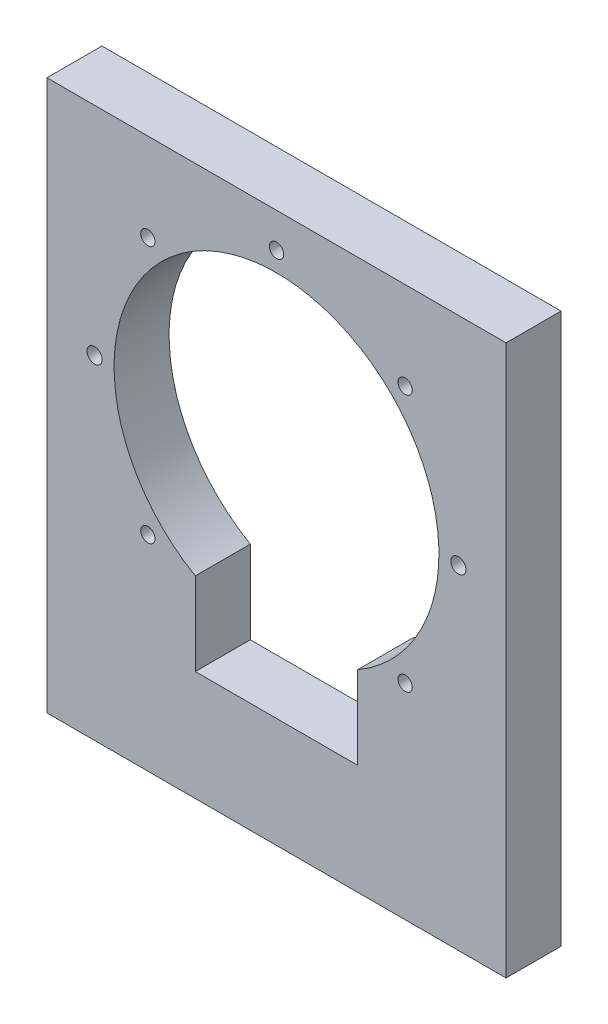
ISO-10303-21;
HEADER;
FILE_DESCRIPTION(('STEP AP214'),'2;1');
FILE_NAME('part.step','',(''),(''),'','','');
FILE_SCHEMA(('AUTOMOTIVE_DESIGN { 1 0 10303 214 1 1 1 1 }'));
ENDSEC;
DATA;
#1=APPLICATION_CONTEXT('core data for automotive mechanical design processes');
#2=APPLICATION_PROTOCOL_DEFINITION('international standard','automotive_design',2000,#1);
#3=PRODUCT_CONTEXT('',#1,'mechanical');
#4=PRODUCT('Part','Part','',(#3));
#5=PRODUCT_RELATED_PRODUCT_CATEGORY('part','',(#4));
#6=PRODUCT_DEFINITION_FORMATION('','',#4);
#7=PRODUCT_DEFINITION_CONTEXT('part definition',#1,'design');
#8=PRODUCT_DEFINITION('design','',#6,#7);
#9=PRODUCT_DEFINITION_SHAPE('','',#8);
#10=(LENGTH_UNIT() NAMED_UNIT(*) SI_UNIT(.MILLI.,.METRE.));
#11=(NAMED_UNIT(*) PLANE_ANGLE_UNIT() SI_UNIT($,.RADIAN.));
#12=(NAMED_UNIT(*) SI_UNIT($,.STERADIAN.) SOLID_ANGLE_UNIT());
#13=UNCERTAINTY_MEASURE_WITH_UNIT(LENGTH_MEASURE(1.E-05),#10,'distance_accuracy_value','');
#14=(GEOMETRIC_REPRESENTATION_CONTEXT(3) GLOBAL_UNCERTAINTY_ASSIGNED_CONTEXT((#13)) GLOBAL_UNIT_ASSIGNED_CONTEXT((#10,
#11,#12)) REPRESENTATION_CONTEXT('',''));
#15=CARTESIAN_POINT('',(0.,0.,0.));
#16=DIRECTION('',(0.,0.,1.));
#17=DIRECTION('',(1.,0.,0.));
#18=AXIS2_PLACEMENT_3D('',#15,#16,#17);
#19=CARTESIAN_POINT('',(0.,0.,12.7));
#20=DIRECTION('',(0.,0.,1.));
#21=DIRECTION('',(1.,0.,0.));
#22=AXIS2_PLACEMENT_3D('',#19,#20,#21);
#23=PLANE('',#22);
#24=CARTESIAN_POINT('',(10.9999975500028,26.1999984,12.7));
#25=DIRECTION('',(0.,0.,1.));
#26=DIRECTION('',(1.,0.,0.));
#27=AXIS2_PLACEMENT_3D('',#24,#25,#26);
#28=CIRCLE('',#27,1.746);
#29=CARTESIAN_POINT('',(12.7459975500028,26.1999984,12.7));
#30=VERTEX_POINT('',#29);
#31=EDGE_CURVE('E303',#30,#30,#28,.T.);
#32=ORIENTED_EDGE('',*,*,#31,.F.);
#33=EDGE_LOOP('',(#32));
#34=FACE_BOUND('',#33,.T.);
#35=CARTESIAN_POINT('',(82.6984865422514,-3.49849059224461,12.7));
#36=DIRECTION('',(0.,0.,1.));
#37=DIRECTION('',(1.,0.,0.));
#38=AXIS2_PLACEMENT_3D('',#35,#36,#37);
#39=CIRCLE('',#38,1.64973);
#40=CARTESIAN_POINT('',(84.3482165422514,-3.49849059224461,12.7));
#41=VERTEX_POINT('',#40);
#42=EDGE_CURVE('E319',#41,#41,#39,.T.);
#43=ORIENTED_EDGE('',*,*,#42,.F.);
#44=EDGE_LOOP('',(#43));
#45=FACE_BOUND('',#44,.T.);
#46=CARTESIAN_POINT('',(82.6984865422474,55.8984824922486,12.7));
#47=DIRECTION('',(0.,0.,1.));
#48=DIRECTION('',(1.,0.,0.));
#49=AXIS2_PLACEMENT_3D('',#46,#47,#48);
#50=CIRCLE('',#49,1.64973);
#51=CARTESIAN_POINT('',(84.3482165422474,55.8984824922486,12.7));
#52=VERTEX_POINT('',#51);
#53=EDGE_CURVE('E335',#52,#52,#50,.T.);
#54=ORIENTED_EDGE('',*,*,#53,.F.);
#55=EDGE_LOOP('',(#54));
#56=FACE_BOUND('',#55,.T.);
#57=DIRECTION('',(0.,-1.,0.));
#58=VECTOR('',#57,1.);
#59=CARTESIAN_POINT('',(34.25,-6.27595424191641,12.7));
#60=LINE('',#59,#58);
#61=CARTESIAN_POINT('',(34.25,-6.27595424191641,12.7));
#62=VERTEX_POINT('',#61);
#63=CARTESIAN_POINT('',(34.25,-25.4,12.7));
#64=VERTEX_POINT('',#63);
#65=EDGE_CURVE('E122',#62,#64,#60,.T.);
#66=ORIENTED_EDGE('',*,*,#65,.F.);
#67=CARTESIAN_POINT('',(53.,26.1999984,12.7));
#68=DIRECTION('',(0.,0.,1.));
#69=DIRECTION('',(1.,0.,0.));
#70=AXIS2_PLACEMENT_3D('',#67,#68,#69);
#71=CIRCLE('',#70,37.5);
#72=CARTESIAN_POINT('',(71.7500000000001,-6.27595424191641,12.7));
#73=VERTEX_POINT('',#72);
#74=EDGE_CURVE('E113',#73,#62,#71,.T.);
#75=ORIENTED_EDGE('',*,*,#74,.F.);
#76=DIRECTION('',(0.,1.,0.));
#77=VECTOR('',#76,1.);
#78=CARTESIAN_POINT('',(71.7500000000001,-6.27595424191641,12.7));
#79=LINE('',#78,#77);
#80=CARTESIAN_POINT('',(71.7500000000001,-25.4,12.7));
#81=VERTEX_POINT('',#80);
#82=EDGE_CURVE('E142',#81,#73,#79,.T.);
#83=ORIENTED_EDGE('',*,*,#82,.F.);
#84=DIRECTION('',(1.,0.,0.));
#85=VECTOR('',#84,1.);
#86=CARTESIAN_POINT('',(71.7500000000001,-25.4,12.7));
#87=LINE('',#86,#85);
#88=EDGE_CURVE('E136',#64,#81,#87,.T.);
#89=ORIENTED_EDGE('',*,*,#88,.F.);
#90=EDGE_LOOP('',(#66,#75,#83,#89));
#91=FACE_BOUND('',#90,.T.);
#92=DIRECTION('',(0.,1.,0.));
#93=VECTOR('',#92,1.);
#94=CARTESIAN_POINT('',(106.,76.2,12.7));
#95=LINE('',#94,#93);
#96=CARTESIAN_POINT('',(106.,-50.8,12.7));
#97=VERTEX_POINT('',#96);
#98=CARTESIAN_POINT('',(106.,76.2,12.7));
#99=VERTEX_POINT('',#98);
#100=EDGE_CURVE('E166',#97,#99,#95,.T.);
#101=ORIENTED_EDGE('',*,*,#100,.T.);
#102=DIRECTION('',(-1.,0.,0.));
#103=VECTOR('',#102,1.);
#104=CARTESIAN_POINT('',(0.,76.2,12.7));
#105=LINE('',#104,#103);
#106=CARTESIAN_POINT('',(0.,76.2,12.7));
#107=VERTEX_POINT('',#106);
#108=EDGE_CURVE('E170',#99,#107,#105,.T.);
#109=ORIENTED_EDGE('',*,*,#108,.T.);
#110=DIRECTION('',(0.,-1.,0.));
#111=VECTOR('',#110,1.);
#112=CARTESIAN_POINT('',(0.,76.2,12.7));
#113=LINE('',#112,#111);
#114=CARTESIAN_POINT('',(0.,-50.8,12.7));
#115=VERTEX_POINT('',#114);
#116=EDGE_CURVE('E174',#107,#115,#113,.T.);
#117=ORIENTED_EDGE('',*,*,#116,.T.);
#118=DIRECTION('',(1.,0.,0.));
#119=VECTOR('',#118,1.);
#120=CARTESIAN_POINT('',(0.,-50.8,12.7));
#121=LINE('',#120,#119);
#122=EDGE_CURVE('E177',#115,#97,#121,.T.);
#123=ORIENTED_EDGE('',*,*,#122,.T.);
#124=EDGE_LOOP('',(#101,#109,#117,#123));
#125=FACE_BOUND('',#124,.T.);
#126=CARTESIAN_POINT('',(53.,68.1999984,12.7));
#127=DIRECTION('',(0.,0.,1.));
#128=DIRECTION('',(1.,0.,0.));
#129=AXIS2_PLACEMENT_3D('',#126,#127,#128);
#130=CIRCLE('',#129,1.64973);
#131=CARTESIAN_POINT('',(54.64973,68.1999984,12.7));
#132=VERTEX_POINT('',#131);
#133=EDGE_CURVE('E150',#132,#132,#130,.T.);
#134=ORIENTED_EDGE('',*,*,#133,.F.);
#135=EDGE_LOOP('',(#134));
#136=FACE_BOUND('',#135,.T.);
#137=CARTESIAN_POINT('',(95.0000024500028,26.1999959500028,12.7));
#138=DIRECTION('',(0.,0.,1.));
#139=DIRECTION('',(1.,0.,0.));
#140=AXIS2_PLACEMENT_3D('',#137,#138,#139);
#141=CIRCLE('',#140,1.746);
#142=CARTESIAN_POINT('',(96.7460024500028,26.1999959500028,12.7));
#143=VERTEX_POINT('',#142);
#144=EDGE_CURVE('E327',#143,#143,#141,.T.);
#145=ORIENTED_EDGE('',*,*,#144,.F.);
#146=EDGE_LOOP('',(#145));
#147=FACE_BOUND('',#146,.T.);
#148=CARTESIAN_POINT('',(23.3015134577582,-3.49849059224861,12.7));
#149=DIRECTION('',(0.,0.,1.));
#150=DIRECTION('',(1.,0.,0.));
#151=AXIS2_PLACEMENT_3D('',#148,#149,#150);
#152=CIRCLE('',#151,1.64973);
#153=CARTESIAN_POINT('',(24.9512434577582,-3.49849059224861,12.7));
#154=VERTEX_POINT('',#153);
#155=EDGE_CURVE('E311',#154,#154,#152,.T.);
#156=ORIENTED_EDGE('',*,*,#155,.F.);
#157=EDGE_LOOP('',(#156));
#158=FACE_BOUND('',#157,.T.);
#159=CARTESIAN_POINT('',(23.3015134577542,55.8984824922446,12.7));
#160=DIRECTION('',(0.,0.,1.));
#161=DIRECTION('',(1.,0.,0.));
#162=AXIS2_PLACEMENT_3D('',#159,#160,#161);
#163=CIRCLE('',#162,1.64973);
#164=CARTESIAN_POINT('',(24.9512434577542,55.8984824922446,12.7));
#165=VERTEX_POINT('',#164);
#166=EDGE_CURVE('E290',#165,#165,#163,.T.);
#167=ORIENTED_EDGE('',*,*,#166,.F.);
#168=EDGE_LOOP('',(#167));
#169=FACE_BOUND('',#168,.T.);
#170=ADVANCED_FACE('F47',(#34,#45,#56,#91,#125,#136,#147,#158,#169),#23,.T.);
#171=CARTESIAN_POINT('',(0.,0.,0.));
#172=DIRECTION('',(0.,0.,1.));
#173=DIRECTION('',(1.,0.,0.));
#174=AXIS2_PLACEMENT_3D('',#171,#172,#173);
#175=PLANE('',#174);
#176=DIRECTION('',(0.,1.,0.));
#177=VECTOR('',#176,1.);
#178=CARTESIAN_POINT('',(106.,76.2,0.));
#179=LINE('',#178,#177);
#180=CARTESIAN_POINT('',(106.,-50.8,0.));
#181=VERTEX_POINT('',#180);
#182=CARTESIAN_POINT('',(106.,76.2,0.));
#183=VERTEX_POINT('',#182);
#184=EDGE_CURVE('E131',#181,#183,#179,.T.);
#185=ORIENTED_EDGE('',*,*,#184,.F.);
#186=DIRECTION('',(1.,0.,0.));
#187=VECTOR('',#186,1.);
#188=CARTESIAN_POINT('',(0.,-50.8,0.));
#189=LINE('',#188,#187);
#190=CARTESIAN_POINT('',(0.,-50.8,0.));
#191=VERTEX_POINT('',#190);
#192=EDGE_CURVE('E171',#191,#181,#189,.T.);
#193=ORIENTED_EDGE('',*,*,#192,.F.);
#194=DIRECTION('',(0.,-1.,0.));
#195=VECTOR('',#194,1.);
#196=CARTESIAN_POINT('',(0.,76.2,0.));
#197=LINE('',#196,#195);
#198=CARTESIAN_POINT('',(0.,76.2,0.));
#199=VERTEX_POINT('',#198);
#200=EDGE_CURVE('E187',#199,#191,#197,.T.);
#201=ORIENTED_EDGE('',*,*,#200,.F.);
#202=DIRECTION('',(-1.,0.,0.));
#203=VECTOR('',#202,1.);
#204=CARTESIAN_POINT('',(0.,76.2,0.));
#205=LINE('',#204,#203);
#206=EDGE_CURVE('E184',#183,#199,#205,.T.);
#207=ORIENTED_EDGE('',*,*,#206,.F.);
#208=EDGE_LOOP('',(#185,#193,#201,#207));
#209=FACE_BOUND('',#208,.T.);
#210=CARTESIAN_POINT('',(53.,26.1999984,0.));
#211=DIRECTION('',(0.,0.,1.));
#212=DIRECTION('',(1.,0.,0.));
#213=AXIS2_PLACEMENT_3D('',#210,#211,#212);
#214=CIRCLE('',#213,37.5);
#215=CARTESIAN_POINT('',(71.7500000000001,-6.27595424191641,0.));
#216=VERTEX_POINT('',#215);
#217=CARTESIAN_POINT('',(34.25,-6.27595424191641,0.));
#218=VERTEX_POINT('',#217);
#219=EDGE_CURVE('E71',#216,#218,#214,.T.);
#220=ORIENTED_EDGE('',*,*,#219,.T.);
#221=DIRECTION('',(0.,-1.,0.));
#222=VECTOR('',#221,1.);
#223=CARTESIAN_POINT('',(34.25,-6.27595424191641,0.));
#224=LINE('',#223,#222);
#225=CARTESIAN_POINT('',(34.25,-25.4,0.));
#226=VERTEX_POINT('',#225);
#227=EDGE_CURVE('E129',#218,#226,#224,.T.);
#228=ORIENTED_EDGE('',*,*,#227,.T.);
#229=DIRECTION('',(1.,0.,0.));
#230=VECTOR('',#229,1.);
#231=CARTESIAN_POINT('',(71.7500000000001,-25.4,0.));
#232=LINE('',#231,#230);
#233=CARTESIAN_POINT('',(71.7500000000001,-25.4,0.));
#234=VERTEX_POINT('',#233);
#235=EDGE_CURVE('E153',#226,#234,#232,.T.);
#236=ORIENTED_EDGE('',*,*,#235,.T.);
#237=DIRECTION('',(0.,1.,0.));
#238=VECTOR('',#237,1.);
#239=CARTESIAN_POINT('',(71.7500000000001,-6.27595424191641,0.));
#240=LINE('',#239,#238);
#241=EDGE_CURVE('E123',#234,#216,#240,.T.);
#242=ORIENTED_EDGE('',*,*,#241,.T.);
#243=EDGE_LOOP('',(#220,#228,#236,#242));
#244=FACE_BOUND('',#243,.T.);
#245=CARTESIAN_POINT('',(53.,68.1999984,0.));
#246=DIRECTION('',(0.,0.,1.));
#247=DIRECTION('',(1.,0.,0.));
#248=AXIS2_PLACEMENT_3D('',#245,#246,#247);
#249=CIRCLE('',#248,1.64973);
#250=CARTESIAN_POINT('',(54.64973,68.1999984,0.));
#251=VERTEX_POINT('',#250);
#252=EDGE_CURVE('E339',#251,#251,#249,.T.);
#253=ORIENTED_EDGE('',*,*,#252,.T.);
#254=EDGE_LOOP('',(#253));
#255=FACE_BOUND('',#254,.T.);
#256=CARTESIAN_POINT('',(82.6984865422474,55.8984824922486,0.));
#257=DIRECTION('',(0.,0.,1.));
#258=DIRECTION('',(1.,0.,0.));
#259=AXIS2_PLACEMENT_3D('',#256,#257,#258);
#260=CIRCLE('',#259,1.64973);
#261=CARTESIAN_POINT('',(84.3482165422474,55.8984824922486,0.));
#262=VERTEX_POINT('',#261);
#263=EDGE_CURVE('E331',#262,#262,#260,.T.);
#264=ORIENTED_EDGE('',*,*,#263,.T.);
#265=EDGE_LOOP('',(#264));
#266=FACE_BOUND('',#265,.T.);
#267=CARTESIAN_POINT('',(95.0000024500028,26.1999959500028,0.));
#268=DIRECTION('',(0.,0.,1.));
#269=DIRECTION('',(1.,0.,0.));
#270=AXIS2_PLACEMENT_3D('',#267,#268,#269);
#271=CIRCLE('',#270,1.746);
#272=CARTESIAN_POINT('',(96.7460024500028,26.1999959500028,0.));
#273=VERTEX_POINT('',#272);
#274=EDGE_CURVE('E323',#273,#273,#271,.T.);
#275=ORIENTED_EDGE('',*,*,#274,.T.);
#276=EDGE_LOOP('',(#275));
#277=FACE_BOUND('',#276,.T.);
#278=CARTESIAN_POINT('',(82.6984865422514,-3.49849059224461,0.));
#279=DIRECTION('',(0.,0.,1.));
#280=DIRECTION('',(1.,0.,0.));
#281=AXIS2_PLACEMENT_3D('',#278,#279,#280);
#282=CIRCLE('',#281,1.64973);
#283=CARTESIAN_POINT('',(84.3482165422514,-3.49849059224461,0.));
#284=VERTEX_POINT('',#283);
#285=EDGE_CURVE('E315',#284,#284,#282,.T.);
#286=ORIENTED_EDGE('',*,*,#285,.T.);
#287=EDGE_LOOP('',(#286));
#288=FACE_BOUND('',#287,.T.);
#289=CARTESIAN_POINT('',(23.3015134577582,-3.49849059224861,0.));
#290=DIRECTION('',(0.,0.,1.));
#291=DIRECTION('',(1.,0.,0.));
#292=AXIS2_PLACEMENT_3D('',#289,#290,#291);
#293=CIRCLE('',#292,1.64973);
#294=CARTESIAN_POINT('',(24.9512434577582,-3.49849059224861,0.));
#295=VERTEX_POINT('',#294);
#296=EDGE_CURVE('E307',#295,#295,#293,.T.);
#297=ORIENTED_EDGE('',*,*,#296,.T.);
#298=EDGE_LOOP('',(#297));
#299=FACE_BOUND('',#298,.T.);
#300=CARTESIAN_POINT('',(10.9999975500028,26.1999984,0.));
#301=DIRECTION('',(0.,0.,1.));
#302=DIRECTION('',(1.,0.,0.));
#303=AXIS2_PLACEMENT_3D('',#300,#301,#302);
#304=CIRCLE('',#303,1.746);
#305=CARTESIAN_POINT('',(12.7459975500028,26.1999984,0.));
#306=VERTEX_POINT('',#305);
#307=EDGE_CURVE('E300',#306,#306,#304,.T.);
#308=ORIENTED_EDGE('',*,*,#307,.T.);
#309=EDGE_LOOP('',(#308));
#310=FACE_BOUND('',#309,.T.);
#311=CARTESIAN_POINT('',(23.3015134577542,55.8984824922446,0.));
#312=DIRECTION('',(0.,0.,1.));
#313=DIRECTION('',(1.,0.,0.));
#314=AXIS2_PLACEMENT_3D('',#311,#312,#313);
#315=CIRCLE('',#314,1.64973);
#316=CARTESIAN_POINT('',(24.9512434577542,55.8984824922446,0.));
#317=VERTEX_POINT('',#316);
#318=EDGE_CURVE('E293',#317,#317,#315,.T.);
#319=ORIENTED_EDGE('',*,*,#318,.T.);
#320=EDGE_LOOP('',(#319));
#321=FACE_BOUND('',#320,.T.);
#322=ADVANCED_FACE('F212',(#209,#244,#255,#266,#277,#288,#299,#310,#321),#175,.F.);
#323=CARTESIAN_POINT('',(106.,76.2,12.7));
#324=DIRECTION('',(-1.,0.,0.));
#325=DIRECTION('',(0.,-1.,0.));
#326=AXIS2_PLACEMENT_3D('',#323,#324,#325);
#327=PLANE('',#326);
#328=ORIENTED_EDGE('',*,*,#184,.T.);
#329=DIRECTION('',(0.,0.,-1.));
#330=VECTOR('',#329,1.);
#331=CARTESIAN_POINT('',(106.,76.2,12.7));
#332=LINE('',#331,#330);
#333=EDGE_CURVE('E11',#99,#183,#332,.T.);
#334=ORIENTED_EDGE('',*,*,#333,.F.);
#335=ORIENTED_EDGE('',*,*,#100,.F.);
#336=DIRECTION('',(0.,0.,-1.));
#337=VECTOR('',#336,1.);
#338=CARTESIAN_POINT('',(106.,-50.8,12.7));
#339=LINE('',#338,#337);
#340=EDGE_CURVE('E180',#97,#181,#339,.T.);
#341=ORIENTED_EDGE('',*,*,#340,.T.);
#342=EDGE_LOOP('',(#328,#334,#335,#341));
#343=FACE_BOUND('',#342,.T.);
#344=ADVANCED_FACE('F49',(#343),#327,.F.);
#345=CARTESIAN_POINT('',(0.,76.2,12.7));
#346=DIRECTION('',(0.,-1.,0.));
#347=DIRECTION('',(0.,0.,-1.));
#348=AXIS2_PLACEMENT_3D('',#345,#346,#347);
#349=PLANE('',#348);
#350=ORIENTED_EDGE('',*,*,#206,.T.);
#351=DIRECTION('',(0.,0.,-1.));
#352=VECTOR('',#351,1.);
#353=CARTESIAN_POINT('',(0.,76.2,12.7));
#354=LINE('',#353,#352);
#355=EDGE_CURVE('E56',#107,#199,#354,.T.);
#356=ORIENTED_EDGE('',*,*,#355,.F.);
#357=ORIENTED_EDGE('',*,*,#108,.F.);
#358=ORIENTED_EDGE('',*,*,#333,.T.);
#359=EDGE_LOOP('',(#350,#356,#357,#358));
#360=FACE_BOUND('',#359,.T.);
#361=ADVANCED_FACE('F222',(#360),#349,.F.);
#362=CARTESIAN_POINT('',(0.,76.2,12.7));
#363=DIRECTION('',(1.,0.,0.));
#364=DIRECTION('',(0.,1.,0.));
#365=AXIS2_PLACEMENT_3D('',#362,#363,#364);
#366=PLANE('',#365);
#367=ORIENTED_EDGE('',*,*,#200,.T.);
#368=DIRECTION('',(0.,0.,-1.));
#369=VECTOR('',#368,1.);
#370=CARTESIAN_POINT('',(0.,-50.8,12.7));
#371=LINE('',#370,#369);
#372=EDGE_CURVE('E195',#115,#191,#371,.T.);
#373=ORIENTED_EDGE('',*,*,#372,.F.);
#374=ORIENTED_EDGE('',*,*,#116,.F.);
#375=ORIENTED_EDGE('',*,*,#355,.T.);
#376=EDGE_LOOP('',(#367,#373,#374,#375));
#377=FACE_BOUND('',#376,.T.);
#378=ADVANCED_FACE('F206',(#377),#366,.F.);
#379=CARTESIAN_POINT('',(0.,-50.8,12.7));
#380=DIRECTION('',(0.,1.,0.));
#381=DIRECTION('',(0.,0.,1.));
#382=AXIS2_PLACEMENT_3D('',#379,#380,#381);
#383=PLANE('',#382);
#384=ORIENTED_EDGE('',*,*,#192,.T.);
#385=ORIENTED_EDGE('',*,*,#340,.F.);
#386=ORIENTED_EDGE('',*,*,#122,.F.);
#387=ORIENTED_EDGE('',*,*,#372,.T.);
#388=EDGE_LOOP('',(#384,#385,#386,#387));
#389=FACE_BOUND('',#388,.T.);
#390=ADVANCED_FACE('F216',(#389),#383,.F.);
#391=CARTESIAN_POINT('',(53.,26.1999984,12.7));
#392=DIRECTION('',(0.,0.,-1.));
#393=DIRECTION('',(-1.,0.,0.));
#394=AXIS2_PLACEMENT_3D('',#391,#392,#393);
#395=CYLINDRICAL_SURFACE('',#394,37.5);
#396=ORIENTED_EDGE('',*,*,#219,.F.);
#397=DIRECTION('',(0.,0.,-1.));
#398=VECTOR('',#397,1.);
#399=CARTESIAN_POINT('',(71.7500000000001,-6.27595424191641,12.7));
#400=LINE('',#399,#398);
#401=EDGE_CURVE('E117',#73,#216,#400,.T.);
#402=ORIENTED_EDGE('',*,*,#401,.F.);
#403=ORIENTED_EDGE('',*,*,#74,.T.);
#404=DIRECTION('',(0.,0.,-1.));
#405=VECTOR('',#404,1.);
#406=CARTESIAN_POINT('',(34.25,-6.27595424191641,12.7));
#407=LINE('',#406,#405);
#408=EDGE_CURVE('E116',#62,#218,#407,.T.);
#409=ORIENTED_EDGE('',*,*,#408,.T.);
#410=EDGE_LOOP('',(#396,#402,#403,#409));
#411=FACE_BOUND('',#410,.T.);
#412=ADVANCED_FACE('F115',(#411),#395,.F.);
#413=CARTESIAN_POINT('',(34.25,-6.27595424191641,12.7));
#414=DIRECTION('',(1.,0.,0.));
#415=DIRECTION('',(0.,1.,0.));
#416=AXIS2_PLACEMENT_3D('',#413,#414,#415);
#417=PLANE('',#416);
#418=ORIENTED_EDGE('',*,*,#227,.F.);
#419=ORIENTED_EDGE('',*,*,#408,.F.);
#420=ORIENTED_EDGE('',*,*,#65,.T.);
#421=DIRECTION('',(0.,0.,-1.));
#422=VECTOR('',#421,1.);
#423=CARTESIAN_POINT('',(34.25,-25.4,12.7));
#424=LINE('',#423,#422);
#425=EDGE_CURVE('E132',#64,#226,#424,.T.);
#426=ORIENTED_EDGE('',*,*,#425,.T.);
#427=EDGE_LOOP('',(#418,#419,#420,#426));
#428=FACE_BOUND('',#427,.T.);
#429=ADVANCED_FACE('F126',(#428),#417,.T.);
#430=CARTESIAN_POINT('',(71.7500000000001,-25.4,12.7));
#431=DIRECTION('',(0.,1.,0.));
#432=DIRECTION('',(-1.,0.,0.));
#433=AXIS2_PLACEMENT_3D('',#430,#431,#432);
#434=PLANE('',#433);
#435=ORIENTED_EDGE('',*,*,#235,.F.);
#436=ORIENTED_EDGE('',*,*,#425,.F.);
#437=ORIENTED_EDGE('',*,*,#88,.T.);
#438=DIRECTION('',(0.,0.,-1.));
#439=VECTOR('',#438,1.);
#440=CARTESIAN_POINT('',(71.7500000000001,-25.4,12.7));
#441=LINE('',#440,#439);
#442=EDGE_CURVE('E63',#81,#234,#441,.T.);
#443=ORIENTED_EDGE('',*,*,#442,.T.);
#444=EDGE_LOOP('',(#435,#436,#437,#443));
#445=FACE_BOUND('',#444,.T.);
#446=ADVANCED_FACE('F248',(#445),#434,.T.);
#447=CARTESIAN_POINT('',(71.7500000000001,-6.27595424191641,12.7));
#448=DIRECTION('',(-1.,0.,0.));
#449=DIRECTION('',(0.,0.,1.));
#450=AXIS2_PLACEMENT_3D('',#447,#448,#449);
#451=PLANE('',#450);
#452=ORIENTED_EDGE('',*,*,#241,.F.);
#453=ORIENTED_EDGE('',*,*,#442,.F.);
#454=ORIENTED_EDGE('',*,*,#82,.T.);
#455=ORIENTED_EDGE('',*,*,#401,.T.);
#456=EDGE_LOOP('',(#452,#453,#454,#455));
#457=FACE_BOUND('',#456,.T.);
#458=ADVANCED_FACE('F252',(#457),#451,.T.);
#459=CARTESIAN_POINT('',(53.,68.1999984,12.7));
#460=DIRECTION('',(0.,0.,-1.));
#461=DIRECTION('',(-1.,0.,0.));
#462=AXIS2_PLACEMENT_3D('',#459,#460,#461);
#463=CYLINDRICAL_SURFACE('',#462,1.64973);
#464=ORIENTED_EDGE('',*,*,#133,.T.);
#465=EDGE_LOOP('',(#464));
#466=FACE_BOUND('',#465,.T.);
#467=ORIENTED_EDGE('',*,*,#252,.F.);
#468=EDGE_LOOP('',(#467));
#469=FACE_BOUND('',#468,.T.);
#470=ADVANCED_FACE('F258',(#466,#469),#463,.F.);
#471=CARTESIAN_POINT('',(82.6984865422474,55.8984824922486,12.7));
#472=DIRECTION('',(0.,0.,-1.));
#473=DIRECTION('',(-1.,0.,0.));
#474=AXIS2_PLACEMENT_3D('',#471,#472,#473);
#475=CYLINDRICAL_SURFACE('',#474,1.64973);
#476=ORIENTED_EDGE('',*,*,#53,.T.);
#477=EDGE_LOOP('',(#476));
#478=FACE_BOUND('',#477,.T.);
#479=ORIENTED_EDGE('',*,*,#263,.F.);
#480=EDGE_LOOP('',(#479));
#481=FACE_BOUND('',#480,.T.);
#482=ADVANCED_FACE('F261',(#478,#481),#475,.F.);
#483=CARTESIAN_POINT('',(95.0000024500028,26.1999959500028,12.7));
#484=DIRECTION('',(0.,0.,-1.));
#485=DIRECTION('',(-1.,0.,0.));
#486=AXIS2_PLACEMENT_3D('',#483,#484,#485);
#487=CYLINDRICAL_SURFACE('',#486,1.746);
#488=ORIENTED_EDGE('',*,*,#144,.T.);
#489=EDGE_LOOP('',(#488));
#490=FACE_BOUND('',#489,.T.);
#491=ORIENTED_EDGE('',*,*,#274,.F.);
#492=EDGE_LOOP('',(#491));
#493=FACE_BOUND('',#492,.T.);
#494=ADVANCED_FACE('F265',(#490,#493),#487,.F.);
#495=CARTESIAN_POINT('',(82.6984865422514,-3.49849059224461,12.7));
#496=DIRECTION('',(0.,0.,-1.));
#497=DIRECTION('',(-1.,0.,0.));
#498=AXIS2_PLACEMENT_3D('',#495,#496,#497);
#499=CYLINDRICAL_SURFACE('',#498,1.64973);
#500=ORIENTED_EDGE('',*,*,#42,.T.);
#501=EDGE_LOOP('',(#500));
#502=FACE_BOUND('',#501,.T.);
#503=ORIENTED_EDGE('',*,*,#285,.F.);
#504=EDGE_LOOP('',(#503));
#505=FACE_BOUND('',#504,.T.);
#506=ADVANCED_FACE('F269',(#502,#505),#499,.F.);
#507=CARTESIAN_POINT('',(23.3015134577582,-3.49849059224861,12.7));
#508=DIRECTION('',(0.,0.,-1.));
#509=DIRECTION('',(-1.,0.,0.));
#510=AXIS2_PLACEMENT_3D('',#507,#508,#509);
#511=CYLINDRICAL_SURFACE('',#510,1.64973);
#512=ORIENTED_EDGE('',*,*,#155,.T.);
#513=EDGE_LOOP('',(#512));
#514=FACE_BOUND('',#513,.T.);
#515=ORIENTED_EDGE('',*,*,#296,.F.);
#516=EDGE_LOOP('',(#515));
#517=FACE_BOUND('',#516,.T.);
#518=ADVANCED_FACE('F273',(#514,#517),#511,.F.);
#519=CARTESIAN_POINT('',(10.9999975500028,26.1999984,12.7));
#520=DIRECTION('',(0.,0.,-1.));
#521=DIRECTION('',(-1.,0.,0.));
#522=AXIS2_PLACEMENT_3D('',#519,#520,#521);
#523=CYLINDRICAL_SURFACE('',#522,1.746);
#524=ORIENTED_EDGE('',*,*,#31,.T.);
#525=EDGE_LOOP('',(#524));
#526=FACE_BOUND('',#525,.T.);
#527=ORIENTED_EDGE('',*,*,#307,.F.);
#528=EDGE_LOOP('',(#527));
#529=FACE_BOUND('',#528,.T.);
#530=ADVANCED_FACE('F277',(#526,#529),#523,.F.);
#531=CARTESIAN_POINT('',(23.3015134577542,55.8984824922446,12.7));
#532=DIRECTION('',(0.,0.,-1.));
#533=DIRECTION('',(-1.,0.,0.));
#534=AXIS2_PLACEMENT_3D('',#531,#532,#533);
#535=CYLINDRICAL_SURFACE('',#534,1.64973);
#536=ORIENTED_EDGE('',*,*,#166,.T.);
#537=EDGE_LOOP('',(#536));
#538=FACE_BOUND('',#537,.T.);
#539=ORIENTED_EDGE('',*,*,#318,.F.);
#540=EDGE_LOOP('',(#539));
#541=FACE_BOUND('',#540,.T.);
#542=ADVANCED_FACE('F281',(#538,#541),#535,.F.);
#543=CLOSED_SHELL('',(#170,#322,#344,#361,#378,#390,#412,#429,#446,#458,#470,#482,#494,#506,
#518,#530,#542));
#544=MANIFOLD_SOLID_BREP('B2',#543);
#545=ADVANCED_BREP_SHAPE_REPRESENTATION('',(#18,#544),#14);
#546=SHAPE_DEFINITION_REPRESENTATION(#9,#545);
ENDSEC;
END-ISO-10303-21;
